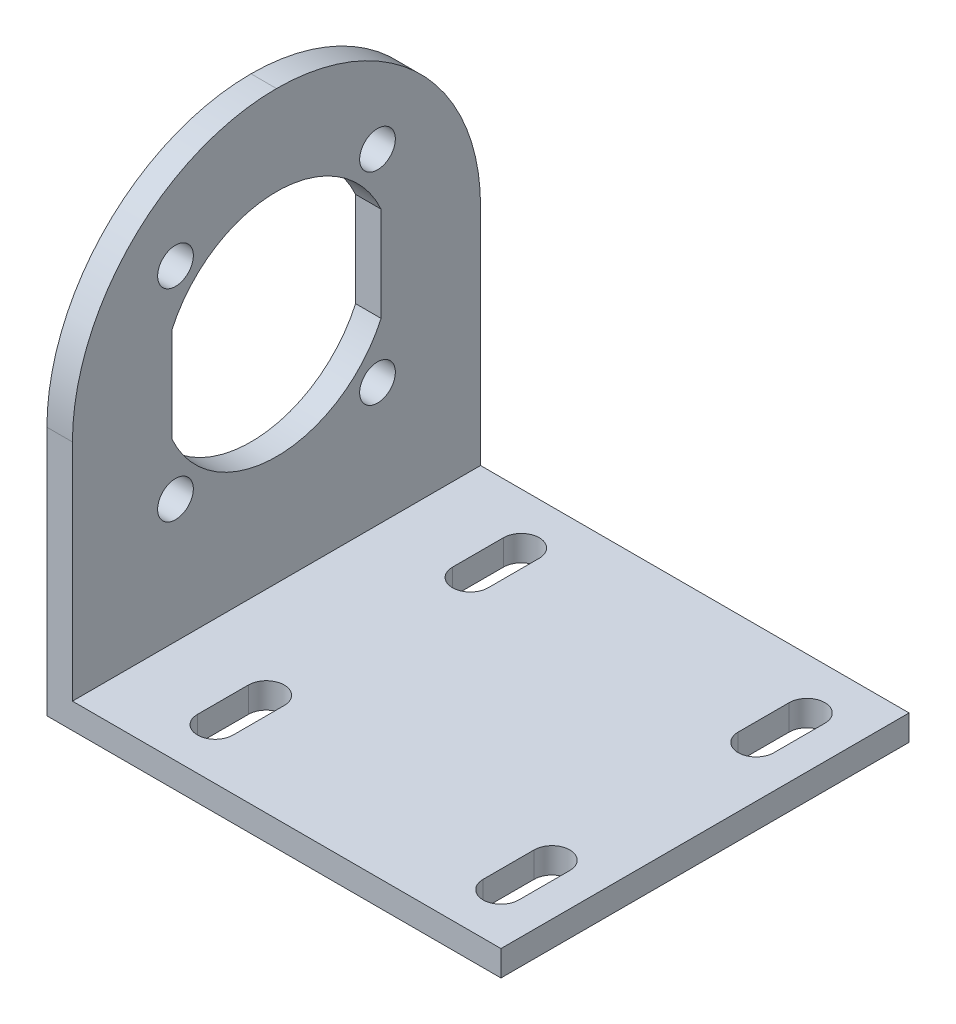
ISO-10303-21;
HEADER;
FILE_DESCRIPTION(('STEP AP214'),'2;1');
FILE_NAME('part.step','',(''),(''),'','','');
FILE_SCHEMA(('AUTOMOTIVE_DESIGN { 1 0 10303 214 1 1 1 1 }'));
ENDSEC;
DATA;
#1=APPLICATION_CONTEXT('core data for automotive mechanical design processes');
#2=APPLICATION_PROTOCOL_DEFINITION('international standard','automotive_design',2000,#1);
#3=PRODUCT_CONTEXT('',#1,'mechanical');
#4=PRODUCT('Part','Part','',(#3));
#5=PRODUCT_RELATED_PRODUCT_CATEGORY('part','',(#4));
#6=PRODUCT_DEFINITION_FORMATION('','',#4);
#7=PRODUCT_DEFINITION_CONTEXT('part definition',#1,'design');
#8=PRODUCT_DEFINITION('design','',#6,#7);
#9=PRODUCT_DEFINITION_SHAPE('','',#8);
#10=(LENGTH_UNIT() NAMED_UNIT(*) SI_UNIT(.MILLI.,.METRE.));
#11=(NAMED_UNIT(*) PLANE_ANGLE_UNIT() SI_UNIT($,.RADIAN.));
#12=(NAMED_UNIT(*) SI_UNIT($,.STERADIAN.) SOLID_ANGLE_UNIT());
#13=UNCERTAINTY_MEASURE_WITH_UNIT(LENGTH_MEASURE(1.E-05),#10,'distance_accuracy_value','');
#14=(GEOMETRIC_REPRESENTATION_CONTEXT(3) GLOBAL_UNCERTAINTY_ASSIGNED_CONTEXT((#13)) GLOBAL_UNIT_ASSIGNED_CONTEXT((#10,
#11,#12)) REPRESENTATION_CONTEXT('',''));
#15=CARTESIAN_POINT('',(0.,0.,0.));
#16=DIRECTION('',(0.,0.,1.));
#17=DIRECTION('',(1.,0.,0.));
#18=AXIS2_PLACEMENT_3D('',#15,#16,#17);
#19=CARTESIAN_POINT('',(0.,44.5,20.));
#20=DIRECTION('',(1.,0.,0.));
#21=DIRECTION('',(0.,1.,0.));
#22=AXIS2_PLACEMENT_3D('',#19,#20,#21);
#23=PLANE('',#22);
#24=CARTESIAN_POINT('',(0.,34.3994949366117,-9.89949493661168));
#25=DIRECTION('',(1.,0.,0.));
#26=DIRECTION('',(0.,1.,0.));
#27=AXIS2_PLACEMENT_3D('',#24,#25,#26);
#28=CIRCLE('',#27,1.75);
#29=CARTESIAN_POINT('',(0.,36.1494949366117,-9.89949493661168));
#30=VERTEX_POINT('',#29);
#31=EDGE_CURVE('E371',#30,#30,#28,.F.);
#32=ORIENTED_EDGE('',*,*,#31,.F.);
#33=EDGE_LOOP('',(#32));
#34=FACE_BOUND('',#33,.T.);
#35=CARTESIAN_POINT('',(0.,34.3994949366117,9.89949493661165));
#36=DIRECTION('',(1.,0.,0.));
#37=DIRECTION('',(0.,1.,0.));
#38=AXIS2_PLACEMENT_3D('',#35,#36,#37);
#39=CIRCLE('',#38,1.75);
#40=CARTESIAN_POINT('',(0.,36.1494949366117,9.89949493661165));
#41=VERTEX_POINT('',#40);
#42=EDGE_CURVE('E365',#41,#41,#39,.F.);
#43=ORIENTED_EDGE('',*,*,#42,.F.);
#44=EDGE_LOOP('',(#43));
#45=FACE_BOUND('',#44,.T.);
#46=CARTESIAN_POINT('',(0.,14.6005050633884,9.89949493661168));
#47=DIRECTION('',(1.,0.,0.));
#48=DIRECTION('',(0.,1.,0.));
#49=AXIS2_PLACEMENT_3D('',#46,#47,#48);
#50=CIRCLE('',#49,1.75);
#51=CARTESIAN_POINT('',(0.,16.3505050633884,9.89949493661168));
#52=VERTEX_POINT('',#51);
#53=EDGE_CURVE('E358',#52,#52,#50,.F.);
#54=ORIENTED_EDGE('',*,*,#53,.F.);
#55=EDGE_LOOP('',(#54));
#56=FACE_BOUND('',#55,.T.);
#57=CARTESIAN_POINT('',(0.,14.6005050633883,-9.89949493661165));
#58=DIRECTION('',(1.,0.,0.));
#59=DIRECTION('',(0.,1.,0.));
#60=AXIS2_PLACEMENT_3D('',#57,#58,#59);
#61=CIRCLE('',#60,1.74999999999999);
#62=CARTESIAN_POINT('',(0.,16.3505050633883,-9.89949493661165));
#63=VERTEX_POINT('',#62);
#64=EDGE_CURVE('E357',#63,#63,#61,.F.);
#65=ORIENTED_EDGE('',*,*,#64,.F.);
#66=EDGE_LOOP('',(#65));
#67=FACE_BOUND('',#66,.T.);
#68=DIRECTION('',(0.,-1.,0.));
#69=VECTOR('',#68,1.);
#70=CARTESIAN_POINT('',(0.,29.1368092477479,-10.25));
#71=LINE('',#70,#69);
#72=CARTESIAN_POINT('',(0.,29.1368092477479,-10.25));
#73=VERTEX_POINT('',#72);
#74=CARTESIAN_POINT('',(0.,19.8631907522521,-10.25));
#75=VERTEX_POINT('',#74);
#76=EDGE_CURVE('E379',#73,#75,#71,.T.);
#77=ORIENTED_EDGE('',*,*,#76,.F.);
#78=CARTESIAN_POINT('',(0.,24.5,0.));
#79=DIRECTION('',(1.,0.,0.));
#80=DIRECTION('',(0.,1.,0.));
#81=AXIS2_PLACEMENT_3D('',#78,#79,#80);
#82=CIRCLE('',#81,11.25);
#83=CARTESIAN_POINT('',(0.,29.1368092477478,10.25));
#84=VERTEX_POINT('',#83);
#85=EDGE_CURVE('E382',#84,#73,#82,.F.);
#86=ORIENTED_EDGE('',*,*,#85,.F.);
#87=DIRECTION('',(0.,1.,0.));
#88=VECTOR('',#87,1.);
#89=CARTESIAN_POINT('',(0.,29.1368092477478,10.25));
#90=LINE('',#89,#88);
#91=CARTESIAN_POINT('',(0.,19.8631907522522,10.25));
#92=VERTEX_POINT('',#91);
#93=EDGE_CURVE('E399',#92,#84,#90,.T.);
#94=ORIENTED_EDGE('',*,*,#93,.F.);
#95=CARTESIAN_POINT('',(0.,24.5,0.));
#96=DIRECTION('',(1.,0.,0.));
#97=DIRECTION('',(0.,1.,0.));
#98=AXIS2_PLACEMENT_3D('',#95,#96,#97);
#99=CIRCLE('',#98,11.25);
#100=EDGE_CURVE('E361',#75,#92,#99,.F.);
#101=ORIENTED_EDGE('',*,*,#100,.F.);
#102=EDGE_LOOP('',(#77,#86,#94,#101));
#103=FACE_BOUND('',#102,.T.);
#104=CARTESIAN_POINT('',(0.,24.5,0.));
#105=DIRECTION('',(1.,0.,0.));
#106=DIRECTION('',(0.,1.,0.));
#107=AXIS2_PLACEMENT_3D('',#104,#105,#106);
#108=CIRCLE('',#107,20.);
#109=CARTESIAN_POINT('',(0.,24.5,20.));
#110=VERTEX_POINT('',#109);
#111=CARTESIAN_POINT('',(0.,44.5,0.));
#112=VERTEX_POINT('',#111);
#113=EDGE_CURVE('E442',#110,#112,#108,.F.);
#114=ORIENTED_EDGE('',*,*,#113,.T.);
#115=CARTESIAN_POINT('',(0.,24.5,0.));
#116=DIRECTION('',(1.,0.,0.));
#117=DIRECTION('',(0.,1.,0.));
#118=AXIS2_PLACEMENT_3D('',#115,#116,#117);
#119=CIRCLE('',#118,20.);
#120=CARTESIAN_POINT('',(0.,24.5,-20.));
#121=VERTEX_POINT('',#120);
#122=EDGE_CURVE('E444',#112,#121,#119,.F.);
#123=ORIENTED_EDGE('',*,*,#122,.T.);
#124=DIRECTION('',(0.,-1.,0.));
#125=VECTOR('',#124,1.);
#126=CARTESIAN_POINT('',(0.,44.5,-20.));
#127=LINE('',#126,#125);
#128=CARTESIAN_POINT('',(0.,0.,-20.));
#129=VERTEX_POINT('',#128);
#130=EDGE_CURVE('E421',#121,#129,#127,.T.);
#131=ORIENTED_EDGE('',*,*,#130,.T.);
#132=DIRECTION('',(0.,0.,-1.));
#133=VECTOR('',#132,1.);
#134=CARTESIAN_POINT('',(0.,0.,20.));
#135=LINE('',#134,#133);
#136=CARTESIAN_POINT('',(0.,0.,20.));
#137=VERTEX_POINT('',#136);
#138=EDGE_CURVE('E439',#137,#129,#135,.T.);
#139=ORIENTED_EDGE('',*,*,#138,.F.);
#140=DIRECTION('',(0.,-1.,0.));
#141=VECTOR('',#140,1.);
#142=CARTESIAN_POINT('',(0.,44.5,20.));
#143=LINE('',#142,#141);
#144=EDGE_CURVE('E408',#110,#137,#143,.T.);
#145=ORIENTED_EDGE('',*,*,#144,.F.);
#146=EDGE_LOOP('',(#114,#123,#131,#139,#145));
#147=FACE_BOUND('',#146,.T.);
#148=ADVANCED_FACE('F40',(#34,#45,#56,#67,#103,#147),#23,.F.);
#149=CARTESIAN_POINT('',(0.,0.,20.));
#150=DIRECTION('',(0.,1.,0.));
#151=DIRECTION('',(0.,0.,1.));
#152=AXIS2_PLACEMENT_3D('',#149,#150,#151);
#153=PLANE('',#152);
#154=DIRECTION('',(0.,0.,1.));
#155=VECTOR('',#154,1.);
#156=CARTESIAN_POINT('',(41.25,0.,10.));
#157=LINE('',#156,#155);
#158=CARTESIAN_POINT('',(41.25,0.,10.));
#159=VERTEX_POINT('',#158);
#160=CARTESIAN_POINT('',(41.25,0.,15.));
#161=VERTEX_POINT('',#160);
#162=EDGE_CURVE('E263',#159,#161,#157,.T.);
#163=ORIENTED_EDGE('',*,*,#162,.F.);
#164=CARTESIAN_POINT('',(39.5,0.,10.));
#165=DIRECTION('',(0.,1.,0.));
#166=DIRECTION('',(0.,0.,1.));
#167=AXIS2_PLACEMENT_3D('',#164,#165,#166);
#168=CIRCLE('',#167,1.75000000000001);
#169=CARTESIAN_POINT('',(37.75,0.,10.));
#170=VERTEX_POINT('',#169);
#171=EDGE_CURVE('E267',#170,#159,#168,.F.);
#172=ORIENTED_EDGE('',*,*,#171,.F.);
#173=DIRECTION('',(0.,0.,-1.));
#174=VECTOR('',#173,1.);
#175=CARTESIAN_POINT('',(37.75,0.,10.));
#176=LINE('',#175,#174);
#177=CARTESIAN_POINT('',(37.75,0.,15.));
#178=VERTEX_POINT('',#177);
#179=EDGE_CURVE('E284',#178,#170,#176,.T.);
#180=ORIENTED_EDGE('',*,*,#179,.F.);
#181=CARTESIAN_POINT('',(39.5,0.,15.));
#182=DIRECTION('',(0.,1.,0.));
#183=DIRECTION('',(0.,0.,1.));
#184=AXIS2_PLACEMENT_3D('',#181,#182,#183);
#185=CIRCLE('',#184,1.75000000000001);
#186=EDGE_CURVE('E56',#161,#178,#185,.F.);
#187=ORIENTED_EDGE('',*,*,#186,.F.);
#188=EDGE_LOOP('',(#163,#172,#180,#187));
#189=FACE_BOUND('',#188,.T.);
#190=DIRECTION('',(0.,0.,1.));
#191=VECTOR('',#190,1.);
#192=CARTESIAN_POINT('',(13.25,0.,-15.));
#193=LINE('',#192,#191);
#194=CARTESIAN_POINT('',(13.25,0.,-15.));
#195=VERTEX_POINT('',#194);
#196=CARTESIAN_POINT('',(13.25,0.,-10.));
#197=VERTEX_POINT('',#196);
#198=EDGE_CURVE('E295',#195,#197,#193,.T.);
#199=ORIENTED_EDGE('',*,*,#198,.F.);
#200=CARTESIAN_POINT('',(11.5,0.,-15.));
#201=DIRECTION('',(0.,1.,0.));
#202=DIRECTION('',(0.,0.,1.));
#203=AXIS2_PLACEMENT_3D('',#200,#201,#202);
#204=CIRCLE('',#203,1.75);
#205=CARTESIAN_POINT('',(9.75000000000002,0.,-15.));
#206=VERTEX_POINT('',#205);
#207=EDGE_CURVE('E298',#206,#195,#204,.F.);
#208=ORIENTED_EDGE('',*,*,#207,.F.);
#209=DIRECTION('',(0.,0.,-1.));
#210=VECTOR('',#209,1.);
#211=CARTESIAN_POINT('',(9.75000000000002,0.,-15.));
#212=LINE('',#211,#210);
#213=CARTESIAN_POINT('',(9.75000000000002,0.,-10.));
#214=VERTEX_POINT('',#213);
#215=EDGE_CURVE('E264',#214,#206,#212,.T.);
#216=ORIENTED_EDGE('',*,*,#215,.F.);
#217=CARTESIAN_POINT('',(11.5,0.,-10.));
#218=DIRECTION('',(0.,1.,0.));
#219=DIRECTION('',(0.,0.,1.));
#220=AXIS2_PLACEMENT_3D('',#217,#218,#219);
#221=CIRCLE('',#220,1.75);
#222=EDGE_CURVE('E64',#197,#214,#221,.F.);
#223=ORIENTED_EDGE('',*,*,#222,.F.);
#224=EDGE_LOOP('',(#199,#208,#216,#223));
#225=FACE_BOUND('',#224,.T.);
#226=DIRECTION('',(0.,0.,1.));
#227=VECTOR('',#226,1.);
#228=CARTESIAN_POINT('',(41.25,0.,-15.));
#229=LINE('',#228,#227);
#230=CARTESIAN_POINT('',(41.25,0.,-15.));
#231=VERTEX_POINT('',#230);
#232=CARTESIAN_POINT('',(41.25,0.,-10.));
#233=VERTEX_POINT('',#232);
#234=EDGE_CURVE('E244',#231,#233,#229,.T.);
#235=ORIENTED_EDGE('',*,*,#234,.F.);
#236=CARTESIAN_POINT('',(39.5,0.,-15.));
#237=DIRECTION('',(0.,1.,0.));
#238=DIRECTION('',(0.,0.,1.));
#239=AXIS2_PLACEMENT_3D('',#236,#237,#238);
#240=CIRCLE('',#239,1.75);
#241=CARTESIAN_POINT('',(37.75,0.,-15.));
#242=VERTEX_POINT('',#241);
#243=EDGE_CURVE('E223',#242,#231,#240,.F.);
#244=ORIENTED_EDGE('',*,*,#243,.F.);
#245=DIRECTION('',(0.,0.,-1.));
#246=VECTOR('',#245,1.);
#247=CARTESIAN_POINT('',(37.75,0.,-15.));
#248=LINE('',#247,#246);
#249=CARTESIAN_POINT('',(37.75,0.,-10.));
#250=VERTEX_POINT('',#249);
#251=EDGE_CURVE('E235',#250,#242,#248,.T.);
#252=ORIENTED_EDGE('',*,*,#251,.F.);
#253=CARTESIAN_POINT('',(39.5,0.,-10.));
#254=DIRECTION('',(0.,1.,0.));
#255=DIRECTION('',(0.,0.,1.));
#256=AXIS2_PLACEMENT_3D('',#253,#254,#255);
#257=CIRCLE('',#256,1.75);
#258=EDGE_CURVE('E248',#233,#250,#257,.F.);
#259=ORIENTED_EDGE('',*,*,#258,.F.);
#260=EDGE_LOOP('',(#235,#244,#252,#259));
#261=FACE_BOUND('',#260,.T.);
#262=DIRECTION('',(0.,0.,1.));
#263=VECTOR('',#262,1.);
#264=CARTESIAN_POINT('',(13.25,0.,10.));
#265=LINE('',#264,#263);
#266=CARTESIAN_POINT('',(13.25,0.,10.));
#267=VERTEX_POINT('',#266);
#268=CARTESIAN_POINT('',(13.25,0.,15.));
#269=VERTEX_POINT('',#268);
#270=EDGE_CURVE('E324',#267,#269,#265,.T.);
#271=ORIENTED_EDGE('',*,*,#270,.F.);
#272=CARTESIAN_POINT('',(11.5,0.,10.));
#273=DIRECTION('',(0.,1.,0.));
#274=DIRECTION('',(0.,0.,1.));
#275=AXIS2_PLACEMENT_3D('',#272,#273,#274);
#276=CIRCLE('',#275,1.75);
#277=CARTESIAN_POINT('',(9.75000000000002,0.,10.));
#278=VERTEX_POINT('',#277);
#279=EDGE_CURVE('E327',#278,#267,#276,.F.);
#280=ORIENTED_EDGE('',*,*,#279,.F.);
#281=DIRECTION('',(0.,0.,-1.));
#282=VECTOR('',#281,1.);
#283=CARTESIAN_POINT('',(9.75000000000002,0.,10.));
#284=LINE('',#283,#282);
#285=CARTESIAN_POINT('',(9.75000000000002,0.,15.));
#286=VERTEX_POINT('',#285);
#287=EDGE_CURVE('E344',#286,#278,#284,.T.);
#288=ORIENTED_EDGE('',*,*,#287,.F.);
#289=CARTESIAN_POINT('',(11.5,0.,15.));
#290=DIRECTION('',(0.,1.,0.));
#291=DIRECTION('',(0.,0.,1.));
#292=AXIS2_PLACEMENT_3D('',#289,#290,#291);
#293=CIRCLE('',#292,1.75);
#294=EDGE_CURVE('E293',#269,#286,#293,.F.);
#295=ORIENTED_EDGE('',*,*,#294,.F.);
#296=EDGE_LOOP('',(#271,#280,#288,#295));
#297=FACE_BOUND('',#296,.T.);
#298=DIRECTION('',(1.,0.,0.));
#299=VECTOR('',#298,1.);
#300=CARTESIAN_POINT('',(0.,0.,-20.));
#301=LINE('',#300,#299);
#302=CARTESIAN_POINT('',(44.5,0.,-20.));
#303=VERTEX_POINT('',#302);
#304=EDGE_CURVE('E423',#129,#303,#301,.T.);
#305=ORIENTED_EDGE('',*,*,#304,.T.);
#306=DIRECTION('',(0.,0.,-1.));
#307=VECTOR('',#306,1.);
#308=CARTESIAN_POINT('',(44.5,0.,20.));
#309=LINE('',#308,#307);
#310=CARTESIAN_POINT('',(44.5,0.,20.));
#311=VERTEX_POINT('',#310);
#312=EDGE_CURVE('E436',#311,#303,#309,.T.);
#313=ORIENTED_EDGE('',*,*,#312,.F.);
#314=DIRECTION('',(1.,0.,0.));
#315=VECTOR('',#314,1.);
#316=CARTESIAN_POINT('',(0.,0.,20.));
#317=LINE('',#316,#315);
#318=EDGE_CURVE('E410',#137,#311,#317,.T.);
#319=ORIENTED_EDGE('',*,*,#318,.F.);
#320=ORIENTED_EDGE('',*,*,#138,.T.);
#321=EDGE_LOOP('',(#305,#313,#319,#320));
#322=FACE_BOUND('',#321,.T.);
#323=ADVANCED_FACE('F241',(#189,#225,#261,#297,#322),#153,.F.);
#324=CARTESIAN_POINT('',(44.5,0.,20.));
#325=DIRECTION('',(-1.,0.,0.));
#326=DIRECTION('',(0.,-1.,0.));
#327=AXIS2_PLACEMENT_3D('',#324,#325,#326);
#328=PLANE('',#327);
#329=DIRECTION('',(0.,1.,0.));
#330=VECTOR('',#329,1.);
#331=CARTESIAN_POINT('',(44.5,0.,-20.));
#332=LINE('',#331,#330);
#333=CARTESIAN_POINT('',(44.5,2.5,-20.));
#334=VERTEX_POINT('',#333);
#335=EDGE_CURVE('E425',#303,#334,#332,.T.);
#336=ORIENTED_EDGE('',*,*,#335,.T.);
#337=DIRECTION('',(0.,0.,-1.));
#338=VECTOR('',#337,1.);
#339=CARTESIAN_POINT('',(44.5,2.5,20.));
#340=LINE('',#339,#338);
#341=CARTESIAN_POINT('',(44.5,2.5,20.));
#342=VERTEX_POINT('',#341);
#343=EDGE_CURVE('E433',#342,#334,#340,.T.);
#344=ORIENTED_EDGE('',*,*,#343,.F.);
#345=DIRECTION('',(0.,1.,0.));
#346=VECTOR('',#345,1.);
#347=CARTESIAN_POINT('',(44.5,0.,20.));
#348=LINE('',#347,#346);
#349=EDGE_CURVE('E413',#311,#342,#348,.T.);
#350=ORIENTED_EDGE('',*,*,#349,.F.);
#351=ORIENTED_EDGE('',*,*,#312,.T.);
#352=EDGE_LOOP('',(#336,#344,#350,#351));
#353=FACE_BOUND('',#352,.T.);
#354=ADVANCED_FACE('F479',(#353),#328,.F.);
#355=CARTESIAN_POINT('',(44.5,2.5,20.));
#356=DIRECTION('',(0.,-1.,0.));
#357=DIRECTION('',(1.,0.,0.));
#358=AXIS2_PLACEMENT_3D('',#355,#356,#357);
#359=PLANE('',#358);
#360=DIRECTION('',(0.,0.,1.));
#361=VECTOR('',#360,1.);
#362=CARTESIAN_POINT('',(37.75,2.5,10.));
#363=LINE('',#362,#361);
#364=CARTESIAN_POINT('',(37.75,2.5,10.));
#365=VERTEX_POINT('',#364);
#366=CARTESIAN_POINT('',(37.75,2.5,15.));
#367=VERTEX_POINT('',#366);
#368=EDGE_CURVE('E272',#365,#367,#363,.T.);
#369=ORIENTED_EDGE('',*,*,#368,.F.);
#370=CARTESIAN_POINT('',(39.5,2.5,10.));
#371=DIRECTION('',(0.,1.,0.));
#372=DIRECTION('',(-1.,0.,0.));
#373=AXIS2_PLACEMENT_3D('',#370,#371,#372);
#374=CIRCLE('',#373,1.75000000000001);
#375=CARTESIAN_POINT('',(41.25,2.5,10.));
#376=VERTEX_POINT('',#375);
#377=EDGE_CURVE('E270',#376,#365,#374,.T.);
#378=ORIENTED_EDGE('',*,*,#377,.F.);
#379=DIRECTION('',(0.,0.,-1.));
#380=VECTOR('',#379,1.);
#381=CARTESIAN_POINT('',(41.25,2.5,10.));
#382=LINE('',#381,#380);
#383=CARTESIAN_POINT('',(41.25,2.5,15.));
#384=VERTEX_POINT('',#383);
#385=EDGE_CURVE('E278',#384,#376,#382,.T.);
#386=ORIENTED_EDGE('',*,*,#385,.F.);
#387=CARTESIAN_POINT('',(39.5,2.5,15.));
#388=DIRECTION('',(0.,1.,0.));
#389=DIRECTION('',(-1.,0.,0.));
#390=AXIS2_PLACEMENT_3D('',#387,#388,#389);
#391=CIRCLE('',#390,1.75000000000001);
#392=EDGE_CURVE('E275',#367,#384,#391,.T.);
#393=ORIENTED_EDGE('',*,*,#392,.F.);
#394=EDGE_LOOP('',(#369,#378,#386,#393));
#395=FACE_BOUND('',#394,.T.);
#396=DIRECTION('',(0.,0.,1.));
#397=VECTOR('',#396,1.);
#398=CARTESIAN_POINT('',(9.75000000000002,2.5,-15.));
#399=LINE('',#398,#397);
#400=CARTESIAN_POINT('',(9.75000000000002,2.5,-15.));
#401=VERTEX_POINT('',#400);
#402=CARTESIAN_POINT('',(9.75000000000002,2.5,-10.));
#403=VERTEX_POINT('',#402);
#404=EDGE_CURVE('E303',#401,#403,#399,.T.);
#405=ORIENTED_EDGE('',*,*,#404,.F.);
#406=CARTESIAN_POINT('',(11.5,2.5,-15.));
#407=DIRECTION('',(0.,1.,0.));
#408=DIRECTION('',(-1.,0.,0.));
#409=AXIS2_PLACEMENT_3D('',#406,#407,#408);
#410=CIRCLE('',#409,1.75);
#411=CARTESIAN_POINT('',(13.25,2.5,-15.));
#412=VERTEX_POINT('',#411);
#413=EDGE_CURVE('E301',#412,#401,#410,.T.);
#414=ORIENTED_EDGE('',*,*,#413,.F.);
#415=DIRECTION('',(0.,0.,-1.));
#416=VECTOR('',#415,1.);
#417=CARTESIAN_POINT('',(13.25,2.5,-15.));
#418=LINE('',#417,#416);
#419=CARTESIAN_POINT('',(13.25,2.5,-10.));
#420=VERTEX_POINT('',#419);
#421=EDGE_CURVE('E309',#420,#412,#418,.T.);
#422=ORIENTED_EDGE('',*,*,#421,.F.);
#423=CARTESIAN_POINT('',(11.5,2.5,-10.));
#424=DIRECTION('',(0.,1.,0.));
#425=DIRECTION('',(-1.,0.,0.));
#426=AXIS2_PLACEMENT_3D('',#423,#424,#425);
#427=CIRCLE('',#426,1.75);
#428=EDGE_CURVE('E306',#403,#420,#427,.T.);
#429=ORIENTED_EDGE('',*,*,#428,.F.);
#430=EDGE_LOOP('',(#405,#414,#422,#429));
#431=FACE_BOUND('',#430,.T.);
#432=DIRECTION('',(0.,0.,1.));
#433=VECTOR('',#432,1.);
#434=CARTESIAN_POINT('',(37.75,2.5,-15.));
#435=LINE('',#434,#433);
#436=CARTESIAN_POINT('',(37.75,2.5,-15.));
#437=VERTEX_POINT('',#436);
#438=CARTESIAN_POINT('',(37.75,2.5,-10.));
#439=VERTEX_POINT('',#438);
#440=EDGE_CURVE('E246',#437,#439,#435,.T.);
#441=ORIENTED_EDGE('',*,*,#440,.F.);
#442=CARTESIAN_POINT('',(39.5,2.5,-15.));
#443=DIRECTION('',(0.,1.,0.));
#444=DIRECTION('',(-1.,0.,0.));
#445=AXIS2_PLACEMENT_3D('',#442,#443,#444);
#446=CIRCLE('',#445,1.75);
#447=CARTESIAN_POINT('',(41.25,2.5,-15.));
#448=VERTEX_POINT('',#447);
#449=EDGE_CURVE('E226',#448,#437,#446,.T.);
#450=ORIENTED_EDGE('',*,*,#449,.F.);
#451=DIRECTION('',(0.,0.,-1.));
#452=VECTOR('',#451,1.);
#453=CARTESIAN_POINT('',(41.25,2.5,-15.));
#454=LINE('',#453,#452);
#455=CARTESIAN_POINT('',(41.25,2.5,-10.));
#456=VERTEX_POINT('',#455);
#457=EDGE_CURVE('E231',#456,#448,#454,.T.);
#458=ORIENTED_EDGE('',*,*,#457,.F.);
#459=CARTESIAN_POINT('',(39.5,2.5,-10.));
#460=DIRECTION('',(0.,1.,0.));
#461=DIRECTION('',(-1.,0.,0.));
#462=AXIS2_PLACEMENT_3D('',#459,#460,#461);
#463=CIRCLE('',#462,1.75);
#464=EDGE_CURVE('E253',#439,#456,#463,.T.);
#465=ORIENTED_EDGE('',*,*,#464,.F.);
#466=EDGE_LOOP('',(#441,#450,#458,#465));
#467=FACE_BOUND('',#466,.T.);
#468=DIRECTION('',(0.,0.,1.));
#469=VECTOR('',#468,1.);
#470=CARTESIAN_POINT('',(9.75000000000002,2.5,10.));
#471=LINE('',#470,#469);
#472=CARTESIAN_POINT('',(9.75000000000002,2.5,10.));
#473=VERTEX_POINT('',#472);
#474=CARTESIAN_POINT('',(9.75000000000002,2.5,15.));
#475=VERTEX_POINT('',#474);
#476=EDGE_CURVE('E332',#473,#475,#471,.T.);
#477=ORIENTED_EDGE('',*,*,#476,.F.);
#478=CARTESIAN_POINT('',(11.5,2.5,10.));
#479=DIRECTION('',(0.,1.,0.));
#480=DIRECTION('',(-1.,0.,0.));
#481=AXIS2_PLACEMENT_3D('',#478,#479,#480);
#482=CIRCLE('',#481,1.75);
#483=CARTESIAN_POINT('',(13.25,2.5,10.));
#484=VERTEX_POINT('',#483);
#485=EDGE_CURVE('E330',#484,#473,#482,.T.);
#486=ORIENTED_EDGE('',*,*,#485,.F.);
#487=DIRECTION('',(0.,0.,-1.));
#488=VECTOR('',#487,1.);
#489=CARTESIAN_POINT('',(13.25,2.5,10.));
#490=LINE('',#489,#488);
#491=CARTESIAN_POINT('',(13.25,2.5,15.));
#492=VERTEX_POINT('',#491);
#493=EDGE_CURVE('E338',#492,#484,#490,.T.);
#494=ORIENTED_EDGE('',*,*,#493,.F.);
#495=CARTESIAN_POINT('',(11.5,2.5,15.));
#496=DIRECTION('',(0.,1.,0.));
#497=DIRECTION('',(-1.,0.,0.));
#498=AXIS2_PLACEMENT_3D('',#495,#496,#497);
#499=CIRCLE('',#498,1.75);
#500=EDGE_CURVE('E335',#475,#492,#499,.T.);
#501=ORIENTED_EDGE('',*,*,#500,.F.);
#502=EDGE_LOOP('',(#477,#486,#494,#501));
#503=FACE_BOUND('',#502,.T.);
#504=DIRECTION('',(-1.,0.,0.));
#505=VECTOR('',#504,1.);
#506=CARTESIAN_POINT('',(44.5,2.5,-20.));
#507=LINE('',#506,#505);
#508=CARTESIAN_POINT('',(2.5,2.5,-20.));
#509=VERTEX_POINT('',#508);
#510=EDGE_CURVE('E427',#334,#509,#507,.T.);
#511=ORIENTED_EDGE('',*,*,#510,.T.);
#512=DIRECTION('',(0.,0.,-1.));
#513=VECTOR('',#512,1.);
#514=CARTESIAN_POINT('',(2.5,2.5,20.));
#515=LINE('',#514,#513);
#516=CARTESIAN_POINT('',(2.5,2.5,20.));
#517=VERTEX_POINT('',#516);
#518=EDGE_CURVE('E420',#517,#509,#515,.T.);
#519=ORIENTED_EDGE('',*,*,#518,.F.);
#520=DIRECTION('',(-1.,0.,0.));
#521=VECTOR('',#520,1.);
#522=CARTESIAN_POINT('',(44.5,2.5,20.));
#523=LINE('',#522,#521);
#524=EDGE_CURVE('E415',#342,#517,#523,.T.);
#525=ORIENTED_EDGE('',*,*,#524,.F.);
#526=ORIENTED_EDGE('',*,*,#343,.T.);
#527=EDGE_LOOP('',(#511,#519,#525,#526));
#528=FACE_BOUND('',#527,.T.);
#529=ADVANCED_FACE('F486',(#395,#431,#467,#503,#528),#359,.F.);
#530=CARTESIAN_POINT('',(2.5,2.5,20.));
#531=DIRECTION('',(-1.,0.,0.));
#532=DIRECTION('',(0.,-1.,0.));
#533=AXIS2_PLACEMENT_3D('',#530,#531,#532);
#534=PLANE('',#533);
#535=CARTESIAN_POINT('',(2.5,34.3994949366117,-9.89949493661168));
#536=DIRECTION('',(1.,0.,0.));
#537=DIRECTION('',(0.,1.,0.));
#538=AXIS2_PLACEMENT_3D('',#535,#536,#537);
#539=CIRCLE('',#538,1.75);
#540=CARTESIAN_POINT('',(2.5,36.1494949366117,-9.89949493661168));
#541=VERTEX_POINT('',#540);
#542=EDGE_CURVE('E353',#541,#541,#539,.T.);
#543=ORIENTED_EDGE('',*,*,#542,.F.);
#544=EDGE_LOOP('',(#543));
#545=FACE_BOUND('',#544,.T.);
#546=CARTESIAN_POINT('',(2.5,34.3994949366117,9.89949493661165));
#547=DIRECTION('',(1.,0.,0.));
#548=DIRECTION('',(0.,1.,0.));
#549=AXIS2_PLACEMENT_3D('',#546,#547,#548);
#550=CIRCLE('',#549,1.75);
#551=CARTESIAN_POINT('',(2.5,36.1494949366117,9.89949493661165));
#552=VERTEX_POINT('',#551);
#553=EDGE_CURVE('E368',#552,#552,#550,.T.);
#554=ORIENTED_EDGE('',*,*,#553,.F.);
#555=EDGE_LOOP('',(#554));
#556=FACE_BOUND('',#555,.T.);
#557=CARTESIAN_POINT('',(2.5,14.6005050633884,9.89949493661168));
#558=DIRECTION('',(1.,0.,0.));
#559=DIRECTION('',(0.,1.,0.));
#560=AXIS2_PLACEMENT_3D('',#557,#558,#559);
#561=CIRCLE('',#560,1.75);
#562=CARTESIAN_POINT('',(2.5,16.3505050633884,9.89949493661168));
#563=VERTEX_POINT('',#562);
#564=EDGE_CURVE('E362',#563,#563,#561,.T.);
#565=ORIENTED_EDGE('',*,*,#564,.F.);
#566=EDGE_LOOP('',(#565));
#567=FACE_BOUND('',#566,.T.);
#568=CARTESIAN_POINT('',(2.5,14.6005050633883,-9.89949493661165));
#569=DIRECTION('',(1.,0.,0.));
#570=DIRECTION('',(0.,1.,0.));
#571=AXIS2_PLACEMENT_3D('',#568,#569,#570);
#572=CIRCLE('',#571,1.74999999999999);
#573=CARTESIAN_POINT('',(2.5,16.3505050633883,-9.89949493661165));
#574=VERTEX_POINT('',#573);
#575=EDGE_CURVE('E354',#574,#574,#572,.T.);
#576=ORIENTED_EDGE('',*,*,#575,.F.);
#577=EDGE_LOOP('',(#576));
#578=FACE_BOUND('',#577,.T.);
#579=DIRECTION('',(0.,-1.,0.));
#580=VECTOR('',#579,1.);
#581=CARTESIAN_POINT('',(2.5,29.1368092477478,10.25));
#582=LINE('',#581,#580);
#583=CARTESIAN_POINT('',(2.5,29.1368092477478,10.25));
#584=VERTEX_POINT('',#583);
#585=CARTESIAN_POINT('',(2.5,19.8631907522522,10.25));
#586=VERTEX_POINT('',#585);
#587=EDGE_CURVE('E387',#584,#586,#582,.T.);
#588=ORIENTED_EDGE('',*,*,#587,.F.);
#589=CARTESIAN_POINT('',(2.5,24.5,0.));
#590=DIRECTION('',(1.,0.,0.));
#591=DIRECTION('',(0.,1.,0.));
#592=AXIS2_PLACEMENT_3D('',#589,#590,#591);
#593=CIRCLE('',#592,11.25);
#594=CARTESIAN_POINT('',(2.5,29.1368092477479,-10.25));
#595=VERTEX_POINT('',#594);
#596=EDGE_CURVE('E385',#595,#584,#593,.T.);
#597=ORIENTED_EDGE('',*,*,#596,.F.);
#598=DIRECTION('',(0.,1.,0.));
#599=VECTOR('',#598,1.);
#600=CARTESIAN_POINT('',(2.5,29.1368092477479,-10.25));
#601=LINE('',#600,#599);
#602=CARTESIAN_POINT('',(2.5,19.8631907522521,-10.25));
#603=VERTEX_POINT('',#602);
#604=EDGE_CURVE('E393',#603,#595,#601,.T.);
#605=ORIENTED_EDGE('',*,*,#604,.F.);
#606=CARTESIAN_POINT('',(2.5,24.5,0.));
#607=DIRECTION('',(1.,0.,0.));
#608=DIRECTION('',(0.,1.,0.));
#609=AXIS2_PLACEMENT_3D('',#606,#607,#608);
#610=CIRCLE('',#609,11.25);
#611=EDGE_CURVE('E390',#586,#603,#610,.T.);
#612=ORIENTED_EDGE('',*,*,#611,.F.);
#613=EDGE_LOOP('',(#588,#597,#605,#612));
#614=FACE_BOUND('',#613,.T.);
#615=DIRECTION('',(0.,1.,0.));
#616=VECTOR('',#615,1.);
#617=CARTESIAN_POINT('',(2.5,2.5,-20.));
#618=LINE('',#617,#616);
#619=CARTESIAN_POINT('',(2.5,24.5,-20.));
#620=VERTEX_POINT('',#619);
#621=EDGE_CURVE('E411',#509,#620,#618,.T.);
#622=ORIENTED_EDGE('',*,*,#621,.T.);
#623=CARTESIAN_POINT('',(2.5,24.5,0.));
#624=DIRECTION('',(-1.,0.,0.));
#625=DIRECTION('',(0.,-1.,0.));
#626=AXIS2_PLACEMENT_3D('',#623,#624,#625);
#627=CIRCLE('',#626,20.);
#628=CARTESIAN_POINT('',(2.5,44.5,0.));
#629=VERTEX_POINT('',#628);
#630=EDGE_CURVE('E49',#620,#629,#627,.F.);
#631=ORIENTED_EDGE('',*,*,#630,.T.);
#632=CARTESIAN_POINT('',(2.5,24.5,0.));
#633=DIRECTION('',(-1.,0.,0.));
#634=DIRECTION('',(0.,-1.,0.));
#635=AXIS2_PLACEMENT_3D('',#632,#633,#634);
#636=CIRCLE('',#635,20.);
#637=CARTESIAN_POINT('',(2.5,24.5,20.));
#638=VERTEX_POINT('',#637);
#639=EDGE_CURVE('E449',#629,#638,#636,.F.);
#640=ORIENTED_EDGE('',*,*,#639,.T.);
#641=DIRECTION('',(0.,1.,0.));
#642=VECTOR('',#641,1.);
#643=CARTESIAN_POINT('',(2.5,2.5,20.));
#644=LINE('',#643,#642);
#645=EDGE_CURVE('E417',#517,#638,#644,.T.);
#646=ORIENTED_EDGE('',*,*,#645,.F.);
#647=ORIENTED_EDGE('',*,*,#518,.T.);
#648=EDGE_LOOP('',(#622,#631,#640,#646,#647));
#649=FACE_BOUND('',#648,.T.);
#650=ADVANCED_FACE('F453',(#545,#556,#567,#578,#614,#649),#534,.F.);
#651=CARTESIAN_POINT('',(0.,0.,20.));
#652=DIRECTION('',(0.,0.,1.));
#653=DIRECTION('',(1.,0.,0.));
#654=AXIS2_PLACEMENT_3D('',#651,#652,#653);
#655=PLANE('',#654);
#656=ORIENTED_EDGE('',*,*,#645,.T.);
#657=DIRECTION('',(-1.,0.,0.));
#658=VECTOR('',#657,1.);
#659=CARTESIAN_POINT('',(0.,24.5,20.));
#660=LINE('',#659,#658);
#661=EDGE_CURVE('E11',#638,#110,#660,.T.);
#662=ORIENTED_EDGE('',*,*,#661,.T.);
#663=ORIENTED_EDGE('',*,*,#144,.T.);
#664=ORIENTED_EDGE('',*,*,#318,.T.);
#665=ORIENTED_EDGE('',*,*,#349,.T.);
#666=ORIENTED_EDGE('',*,*,#524,.T.);
#667=EDGE_LOOP('',(#656,#662,#663,#664,#665,#666));
#668=FACE_BOUND('',#667,.T.);
#669=ADVANCED_FACE('F483',(#668),#655,.T.);
#670=CARTESIAN_POINT('',(0.,0.,-20.));
#671=DIRECTION('',(0.,0.,1.));
#672=DIRECTION('',(1.,0.,0.));
#673=AXIS2_PLACEMENT_3D('',#670,#671,#672);
#674=PLANE('',#673);
#675=ORIENTED_EDGE('',*,*,#130,.F.);
#676=DIRECTION('',(-1.,0.,0.));
#677=VECTOR('',#676,1.);
#678=CARTESIAN_POINT('',(0.,24.5,-20.));
#679=LINE('',#678,#677);
#680=EDGE_CURVE('E446',#121,#620,#679,.F.);
#681=ORIENTED_EDGE('',*,*,#680,.T.);
#682=ORIENTED_EDGE('',*,*,#621,.F.);
#683=ORIENTED_EDGE('',*,*,#510,.F.);
#684=ORIENTED_EDGE('',*,*,#335,.F.);
#685=ORIENTED_EDGE('',*,*,#304,.F.);
#686=EDGE_LOOP('',(#675,#681,#682,#683,#684,#685));
#687=FACE_BOUND('',#686,.T.);
#688=ADVANCED_FACE('F471',(#687),#674,.F.);
#689=CARTESIAN_POINT('',(0.,24.5,0.));
#690=DIRECTION('',(1.,0.,0.));
#691=DIRECTION('',(0.,0.,-1.));
#692=AXIS2_PLACEMENT_3D('',#689,#690,#691);
#693=CYLINDRICAL_SURFACE('',#692,20.);
#694=ORIENTED_EDGE('',*,*,#661,.F.);
#695=ORIENTED_EDGE('',*,*,#639,.F.);
#696=DIRECTION('',(-1.,0.,0.));
#697=VECTOR('',#696,1.);
#698=CARTESIAN_POINT('',(2.5,44.5,0.));
#699=LINE('',#698,#697);
#700=EDGE_CURVE('E44',#112,#629,#699,.F.);
#701=ORIENTED_EDGE('',*,*,#700,.F.);
#702=ORIENTED_EDGE('',*,*,#113,.F.);
#703=EDGE_LOOP('',(#694,#695,#701,#702));
#704=FACE_BOUND('',#703,.T.);
#705=ADVANCED_FACE('F42',(#704),#693,.T.);
#706=CARTESIAN_POINT('',(2.5,24.5,0.));
#707=DIRECTION('',(-1.,0.,0.));
#708=DIRECTION('',(0.,0.,1.));
#709=AXIS2_PLACEMENT_3D('',#706,#707,#708);
#710=CYLINDRICAL_SURFACE('',#709,20.);
#711=ORIENTED_EDGE('',*,*,#630,.F.);
#712=ORIENTED_EDGE('',*,*,#680,.F.);
#713=ORIENTED_EDGE('',*,*,#122,.F.);
#714=ORIENTED_EDGE('',*,*,#700,.T.);
#715=EDGE_LOOP('',(#711,#712,#713,#714));
#716=FACE_BOUND('',#715,.T.);
#717=ADVANCED_FACE('F464',(#716),#710,.T.);
#718=CARTESIAN_POINT('',(-0.00100000000000187,24.5,0.));
#719=DIRECTION('',(1.,0.,0.));
#720=DIRECTION('',(0.,1.,0.));
#721=AXIS2_PLACEMENT_3D('',#718,#719,#720);
#722=CYLINDRICAL_SURFACE('',#721,11.25);
#723=ORIENTED_EDGE('',*,*,#85,.T.);
#724=DIRECTION('',(1.,0.,0.));
#725=VECTOR('',#724,1.);
#726=CARTESIAN_POINT('',(-0.00100000000000187,29.1368092477479,-10.25));
#727=LINE('',#726,#725);
#728=EDGE_CURVE('E397',#73,#595,#727,.T.);
#729=ORIENTED_EDGE('',*,*,#728,.T.);
#730=ORIENTED_EDGE('',*,*,#596,.T.);
#731=DIRECTION('',(1.,0.,0.));
#732=VECTOR('',#731,1.);
#733=CARTESIAN_POINT('',(-0.00100000000000187,29.1368092477478,10.25));
#734=LINE('',#733,#732);
#735=EDGE_CURVE('E396',#84,#584,#734,.T.);
#736=ORIENTED_EDGE('',*,*,#735,.F.);
#737=EDGE_LOOP('',(#723,#729,#730,#736));
#738=FACE_BOUND('',#737,.T.);
#739=ADVANCED_FACE('F510',(#738),#722,.F.);
#740=CARTESIAN_POINT('',(-0.00100000000000187,29.1368092477479,-10.25));
#741=DIRECTION('',(0.,0.,-1.));
#742=DIRECTION('',(-1.,0.,0.));
#743=AXIS2_PLACEMENT_3D('',#740,#741,#742);
#744=PLANE('',#743);
#745=ORIENTED_EDGE('',*,*,#76,.T.);
#746=DIRECTION('',(1.,0.,0.));
#747=VECTOR('',#746,1.);
#748=CARTESIAN_POINT('',(-0.00100000000000143,19.8631907522521,-10.25));
#749=LINE('',#748,#747);
#750=EDGE_CURVE('E400',#75,#603,#749,.T.);
#751=ORIENTED_EDGE('',*,*,#750,.T.);
#752=ORIENTED_EDGE('',*,*,#604,.T.);
#753=ORIENTED_EDGE('',*,*,#728,.F.);
#754=EDGE_LOOP('',(#745,#751,#752,#753));
#755=FACE_BOUND('',#754,.T.);
#756=ADVANCED_FACE('F515',(#755),#744,.F.);
#757=CARTESIAN_POINT('',(-0.00100000000000187,24.5,0.));
#758=DIRECTION('',(1.,0.,0.));
#759=DIRECTION('',(0.,1.,0.));
#760=AXIS2_PLACEMENT_3D('',#757,#758,#759);
#761=CYLINDRICAL_SURFACE('',#760,11.25);
#762=ORIENTED_EDGE('',*,*,#100,.T.);
#763=DIRECTION('',(1.,0.,0.));
#764=VECTOR('',#763,1.);
#765=CARTESIAN_POINT('',(-0.00100000000000143,19.8631907522522,10.25));
#766=LINE('',#765,#764);
#767=EDGE_CURVE('E402',#92,#586,#766,.T.);
#768=ORIENTED_EDGE('',*,*,#767,.T.);
#769=ORIENTED_EDGE('',*,*,#611,.T.);
#770=ORIENTED_EDGE('',*,*,#750,.F.);
#771=EDGE_LOOP('',(#762,#768,#769,#770));
#772=FACE_BOUND('',#771,.T.);
#773=ADVANCED_FACE('F531',(#772),#761,.F.);
#774=CARTESIAN_POINT('',(-0.00100000000000187,29.1368092477478,10.25));
#775=DIRECTION('',(0.,0.,1.));
#776=DIRECTION('',(1.,0.,0.));
#777=AXIS2_PLACEMENT_3D('',#774,#775,#776);
#778=PLANE('',#777);
#779=ORIENTED_EDGE('',*,*,#93,.T.);
#780=ORIENTED_EDGE('',*,*,#735,.T.);
#781=ORIENTED_EDGE('',*,*,#587,.T.);
#782=ORIENTED_EDGE('',*,*,#767,.F.);
#783=EDGE_LOOP('',(#779,#780,#781,#782));
#784=FACE_BOUND('',#783,.T.);
#785=ADVANCED_FACE('F527',(#784),#778,.F.);
#786=CARTESIAN_POINT('',(-0.001000000000001,14.6005050633883,-9.89949493661165));
#787=DIRECTION('',(1.,0.,0.));
#788=DIRECTION('',(0.,1.,0.));
#789=AXIS2_PLACEMENT_3D('',#786,#787,#788);
#790=CYLINDRICAL_SURFACE('',#789,1.74999999999999);
#791=ORIENTED_EDGE('',*,*,#575,.T.);
#792=EDGE_LOOP('',(#791));
#793=FACE_BOUND('',#792,.T.);
#794=ORIENTED_EDGE('',*,*,#64,.T.);
#795=EDGE_LOOP('',(#794));
#796=FACE_BOUND('',#795,.T.);
#797=ADVANCED_FACE('F530',(#793,#796),#790,.F.);
#798=CARTESIAN_POINT('',(-0.001000000000001,14.6005050633884,9.89949493661168));
#799=DIRECTION('',(1.,0.,0.));
#800=DIRECTION('',(0.,1.,0.));
#801=AXIS2_PLACEMENT_3D('',#798,#799,#800);
#802=CYLINDRICAL_SURFACE('',#801,1.75);
#803=ORIENTED_EDGE('',*,*,#564,.T.);
#804=EDGE_LOOP('',(#803));
#805=FACE_BOUND('',#804,.T.);
#806=ORIENTED_EDGE('',*,*,#53,.T.);
#807=EDGE_LOOP('',(#806));
#808=FACE_BOUND('',#807,.T.);
#809=ADVANCED_FACE('F547',(#805,#808),#802,.F.);
#810=CARTESIAN_POINT('',(-0.0010000000000023,34.3994949366117,9.89949493661165));
#811=DIRECTION('',(1.,0.,0.));
#812=DIRECTION('',(0.,1.,0.));
#813=AXIS2_PLACEMENT_3D('',#810,#811,#812);
#814=CYLINDRICAL_SURFACE('',#813,1.75);
#815=ORIENTED_EDGE('',*,*,#553,.T.);
#816=EDGE_LOOP('',(#815));
#817=FACE_BOUND('',#816,.T.);
#818=ORIENTED_EDGE('',*,*,#42,.T.);
#819=EDGE_LOOP('',(#818));
#820=FACE_BOUND('',#819,.T.);
#821=ADVANCED_FACE('F543',(#817,#820),#814,.F.);
#822=CARTESIAN_POINT('',(-0.0010000000000023,34.3994949366117,-9.89949493661168));
#823=DIRECTION('',(1.,0.,0.));
#824=DIRECTION('',(0.,1.,0.));
#825=AXIS2_PLACEMENT_3D('',#822,#823,#824);
#826=CYLINDRICAL_SURFACE('',#825,1.75);
#827=ORIENTED_EDGE('',*,*,#542,.T.);
#828=EDGE_LOOP('',(#827));
#829=FACE_BOUND('',#828,.T.);
#830=ORIENTED_EDGE('',*,*,#31,.T.);
#831=EDGE_LOOP('',(#830));
#832=FACE_BOUND('',#831,.T.);
#833=ADVANCED_FACE('F539',(#829,#832),#826,.F.);
#834=CARTESIAN_POINT('',(11.5,-0.0010000000000036,10.));
#835=DIRECTION('',(0.,1.,0.));
#836=DIRECTION('',(-1.,0.,0.));
#837=AXIS2_PLACEMENT_3D('',#834,#835,#836);
#838=CYLINDRICAL_SURFACE('',#837,1.75);
#839=ORIENTED_EDGE('',*,*,#279,.T.);
#840=DIRECTION('',(0.,1.,0.));
#841=VECTOR('',#840,1.);
#842=CARTESIAN_POINT('',(13.25,-0.0010000000000036,10.));
#843=LINE('',#842,#841);
#844=EDGE_CURVE('E342',#267,#484,#843,.T.);
#845=ORIENTED_EDGE('',*,*,#844,.T.);
#846=ORIENTED_EDGE('',*,*,#485,.T.);
#847=DIRECTION('',(0.,1.,0.));
#848=VECTOR('',#847,1.);
#849=CARTESIAN_POINT('',(9.75000000000002,-0.00100000000000404,10.));
#850=LINE('',#849,#848);
#851=EDGE_CURVE('E341',#278,#473,#850,.T.);
#852=ORIENTED_EDGE('',*,*,#851,.F.);
#853=EDGE_LOOP('',(#839,#845,#846,#852));
#854=FACE_BOUND('',#853,.T.);
#855=ADVANCED_FACE('F542',(#854),#838,.F.);
#856=CARTESIAN_POINT('',(13.25,-0.0010000000000036,10.));
#857=DIRECTION('',(1.,0.,0.));
#858=DIRECTION('',(0.,1.,0.));
#859=AXIS2_PLACEMENT_3D('',#856,#857,#858);
#860=PLANE('',#859);
#861=ORIENTED_EDGE('',*,*,#270,.T.);
#862=DIRECTION('',(0.,1.,0.));
#863=VECTOR('',#862,1.);
#864=CARTESIAN_POINT('',(13.25,-0.0010000000000036,15.));
#865=LINE('',#864,#863);
#866=EDGE_CURVE('E345',#269,#492,#865,.T.);
#867=ORIENTED_EDGE('',*,*,#866,.T.);
#868=ORIENTED_EDGE('',*,*,#493,.T.);
#869=ORIENTED_EDGE('',*,*,#844,.F.);
#870=EDGE_LOOP('',(#861,#867,#868,#869));
#871=FACE_BOUND('',#870,.T.);
#872=ADVANCED_FACE('F557',(#871),#860,.F.);
#873=CARTESIAN_POINT('',(11.5,-0.0010000000000036,15.));
#874=DIRECTION('',(0.,1.,0.));
#875=DIRECTION('',(-1.,0.,0.));
#876=AXIS2_PLACEMENT_3D('',#873,#874,#875);
#877=CYLINDRICAL_SURFACE('',#876,1.75);
#878=ORIENTED_EDGE('',*,*,#294,.T.);
#879=DIRECTION('',(0.,1.,0.));
#880=VECTOR('',#879,1.);
#881=CARTESIAN_POINT('',(9.75000000000002,-0.0010000000000036,15.));
#882=LINE('',#881,#880);
#883=EDGE_CURVE('E347',#286,#475,#882,.T.);
#884=ORIENTED_EDGE('',*,*,#883,.T.);
#885=ORIENTED_EDGE('',*,*,#500,.T.);
#886=ORIENTED_EDGE('',*,*,#866,.F.);
#887=EDGE_LOOP('',(#878,#884,#885,#886));
#888=FACE_BOUND('',#887,.T.);
#889=ADVANCED_FACE('F562',(#888),#877,.F.);
#890=CARTESIAN_POINT('',(9.75000000000002,-0.00100000000000404,10.));
#891=DIRECTION('',(-1.,0.,0.));
#892=DIRECTION('',(0.,-1.,0.));
#893=AXIS2_PLACEMENT_3D('',#890,#891,#892);
#894=PLANE('',#893);
#895=ORIENTED_EDGE('',*,*,#287,.T.);
#896=ORIENTED_EDGE('',*,*,#851,.T.);
#897=ORIENTED_EDGE('',*,*,#476,.T.);
#898=ORIENTED_EDGE('',*,*,#883,.F.);
#899=EDGE_LOOP('',(#895,#896,#897,#898));
#900=FACE_BOUND('',#899,.T.);
#901=ADVANCED_FACE('F559',(#900),#894,.F.);
#902=CARTESIAN_POINT('',(39.5,-0.00100000000000057,-15.));
#903=DIRECTION('',(0.,1.,0.));
#904=DIRECTION('',(-1.,0.,0.));
#905=AXIS2_PLACEMENT_3D('',#902,#903,#904);
#906=CYLINDRICAL_SURFACE('',#905,1.75);
#907=ORIENTED_EDGE('',*,*,#243,.T.);
#908=DIRECTION('',(0.,1.,0.));
#909=VECTOR('',#908,1.);
#910=CARTESIAN_POINT('',(41.25,-0.00100000000000057,-15.));
#911=LINE('',#910,#909);
#912=EDGE_CURVE('E239',#231,#448,#911,.T.);
#913=ORIENTED_EDGE('',*,*,#912,.T.);
#914=ORIENTED_EDGE('',*,*,#449,.T.);
#915=DIRECTION('',(0.,1.,0.));
#916=VECTOR('',#915,1.);
#917=CARTESIAN_POINT('',(37.75,-0.00100000000000057,-15.));
#918=LINE('',#917,#916);
#919=EDGE_CURVE('E219',#242,#437,#918,.T.);
#920=ORIENTED_EDGE('',*,*,#919,.F.);
#921=EDGE_LOOP('',(#907,#913,#914,#920));
#922=FACE_BOUND('',#921,.T.);
#923=ADVANCED_FACE('F221',(#922),#906,.F.);
#924=CARTESIAN_POINT('',(41.25,-0.00100000000000057,-15.));
#925=DIRECTION('',(1.,0.,0.));
#926=DIRECTION('',(0.,1.,0.));
#927=AXIS2_PLACEMENT_3D('',#924,#925,#926);
#928=PLANE('',#927);
#929=ORIENTED_EDGE('',*,*,#234,.T.);
#930=DIRECTION('',(0.,1.,0.));
#931=VECTOR('',#930,1.);
#932=CARTESIAN_POINT('',(41.25,-0.00100000000000057,-10.));
#933=LINE('',#932,#931);
#934=EDGE_CURVE('E259',#233,#456,#933,.T.);
#935=ORIENTED_EDGE('',*,*,#934,.T.);
#936=ORIENTED_EDGE('',*,*,#457,.T.);
#937=ORIENTED_EDGE('',*,*,#912,.F.);
#938=EDGE_LOOP('',(#929,#935,#936,#937));
#939=FACE_BOUND('',#938,.T.);
#940=ADVANCED_FACE('F602',(#939),#928,.F.);
#941=CARTESIAN_POINT('',(39.5,-0.00100000000000057,-10.));
#942=DIRECTION('',(0.,1.,0.));
#943=DIRECTION('',(-1.,0.,0.));
#944=AXIS2_PLACEMENT_3D('',#941,#942,#943);
#945=CYLINDRICAL_SURFACE('',#944,1.75);
#946=ORIENTED_EDGE('',*,*,#258,.T.);
#947=DIRECTION('',(0.,1.,0.));
#948=VECTOR('',#947,1.);
#949=CARTESIAN_POINT('',(37.75,-0.00100000000000057,-10.));
#950=LINE('',#949,#948);
#951=EDGE_CURVE('E230',#250,#439,#950,.T.);
#952=ORIENTED_EDGE('',*,*,#951,.T.);
#953=ORIENTED_EDGE('',*,*,#464,.T.);
#954=ORIENTED_EDGE('',*,*,#934,.F.);
#955=EDGE_LOOP('',(#946,#952,#953,#954));
#956=FACE_BOUND('',#955,.T.);
#957=ADVANCED_FACE('F605',(#956),#945,.F.);
#958=CARTESIAN_POINT('',(37.75,-0.00100000000000057,-15.));
#959=DIRECTION('',(-1.,0.,0.));
#960=DIRECTION('',(0.,-1.,0.));
#961=AXIS2_PLACEMENT_3D('',#958,#959,#960);
#962=PLANE('',#961);
#963=ORIENTED_EDGE('',*,*,#251,.T.);
#964=ORIENTED_EDGE('',*,*,#919,.T.);
#965=ORIENTED_EDGE('',*,*,#440,.T.);
#966=ORIENTED_EDGE('',*,*,#951,.F.);
#967=EDGE_LOOP('',(#963,#964,#965,#966));
#968=FACE_BOUND('',#967,.T.);
#969=ADVANCED_FACE('F236',(#968),#962,.F.);
#970=CARTESIAN_POINT('',(11.5,-0.0010000000000036,-15.));
#971=DIRECTION('',(0.,1.,0.));
#972=DIRECTION('',(-1.,0.,0.));
#973=AXIS2_PLACEMENT_3D('',#970,#971,#972);
#974=CYLINDRICAL_SURFACE('',#973,1.75);
#975=ORIENTED_EDGE('',*,*,#207,.T.);
#976=DIRECTION('',(0.,1.,0.));
#977=VECTOR('',#976,1.);
#978=CARTESIAN_POINT('',(13.25,-0.0010000000000036,-15.));
#979=LINE('',#978,#977);
#980=EDGE_CURVE('E313',#195,#412,#979,.T.);
#981=ORIENTED_EDGE('',*,*,#980,.T.);
#982=ORIENTED_EDGE('',*,*,#413,.T.);
#983=DIRECTION('',(0.,1.,0.));
#984=VECTOR('',#983,1.);
#985=CARTESIAN_POINT('',(9.75000000000002,-0.00100000000000404,-15.));
#986=LINE('',#985,#984);
#987=EDGE_CURVE('E312',#206,#401,#986,.T.);
#988=ORIENTED_EDGE('',*,*,#987,.F.);
#989=EDGE_LOOP('',(#975,#981,#982,#988));
#990=FACE_BOUND('',#989,.T.);
#991=ADVANCED_FACE('F570',(#990),#974,.F.);
#992=CARTESIAN_POINT('',(13.25,-0.0010000000000036,-15.));
#993=DIRECTION('',(1.,0.,0.));
#994=DIRECTION('',(0.,1.,0.));
#995=AXIS2_PLACEMENT_3D('',#992,#993,#994);
#996=PLANE('',#995);
#997=ORIENTED_EDGE('',*,*,#198,.T.);
#998=DIRECTION('',(0.,1.,0.));
#999=VECTOR('',#998,1.);
#1000=CARTESIAN_POINT('',(13.25,-0.0010000000000036,-10.));
#1001=LINE('',#1000,#999);
#1002=EDGE_CURVE('E315',#197,#420,#1001,.T.);
#1003=ORIENTED_EDGE('',*,*,#1002,.T.);
#1004=ORIENTED_EDGE('',*,*,#421,.T.);
#1005=ORIENTED_EDGE('',*,*,#980,.F.);
#1006=EDGE_LOOP('',(#997,#1003,#1004,#1005));
#1007=FACE_BOUND('',#1006,.T.);
#1008=ADVANCED_FACE('F573',(#1007),#996,.F.);
#1009=CARTESIAN_POINT('',(11.5,-0.0010000000000036,-10.));
#1010=DIRECTION('',(0.,1.,0.));
#1011=DIRECTION('',(-1.,0.,0.));
#1012=AXIS2_PLACEMENT_3D('',#1009,#1010,#1011);
#1013=CYLINDRICAL_SURFACE('',#1012,1.75);
#1014=ORIENTED_EDGE('',*,*,#222,.T.);
#1015=DIRECTION('',(0.,1.,0.));
#1016=VECTOR('',#1015,1.);
#1017=CARTESIAN_POINT('',(9.75000000000002,-0.0010000000000036,-10.));
#1018=LINE('',#1017,#1016);
#1019=EDGE_CURVE('E317',#214,#403,#1018,.T.);
#1020=ORIENTED_EDGE('',*,*,#1019,.T.);
#1021=ORIENTED_EDGE('',*,*,#428,.T.);
#1022=ORIENTED_EDGE('',*,*,#1002,.F.);
#1023=EDGE_LOOP('',(#1014,#1020,#1021,#1022));
#1024=FACE_BOUND('',#1023,.T.);
#1025=ADVANCED_FACE('F579',(#1024),#1013,.F.);
#1026=CARTESIAN_POINT('',(9.75000000000002,-0.00100000000000404,-15.));
#1027=DIRECTION('',(-1.,0.,0.));
#1028=DIRECTION('',(0.,-1.,0.));
#1029=AXIS2_PLACEMENT_3D('',#1026,#1027,#1028);
#1030=PLANE('',#1029);
#1031=ORIENTED_EDGE('',*,*,#215,.T.);
#1032=ORIENTED_EDGE('',*,*,#987,.T.);
#1033=ORIENTED_EDGE('',*,*,#404,.T.);
#1034=ORIENTED_EDGE('',*,*,#1019,.F.);
#1035=EDGE_LOOP('',(#1031,#1032,#1033,#1034));
#1036=FACE_BOUND('',#1035,.T.);
#1037=ADVANCED_FACE('F575',(#1036),#1030,.F.);
#1038=CARTESIAN_POINT('',(39.5,-0.00100000000000057,10.));
#1039=DIRECTION('',(0.,1.,0.));
#1040=DIRECTION('',(-1.,0.,0.));
#1041=AXIS2_PLACEMENT_3D('',#1038,#1039,#1040);
#1042=CYLINDRICAL_SURFACE('',#1041,1.75000000000001);
#1043=ORIENTED_EDGE('',*,*,#171,.T.);
#1044=DIRECTION('',(0.,1.,0.));
#1045=VECTOR('',#1044,1.);
#1046=CARTESIAN_POINT('',(41.25,-0.00100000000000057,10.));
#1047=LINE('',#1046,#1045);
#1048=EDGE_CURVE('E282',#159,#376,#1047,.T.);
#1049=ORIENTED_EDGE('',*,*,#1048,.T.);
#1050=ORIENTED_EDGE('',*,*,#377,.T.);
#1051=DIRECTION('',(0.,1.,0.));
#1052=VECTOR('',#1051,1.);
#1053=CARTESIAN_POINT('',(37.75,-0.00100000000000057,10.));
#1054=LINE('',#1053,#1052);
#1055=EDGE_CURVE('E281',#170,#365,#1054,.T.);
#1056=ORIENTED_EDGE('',*,*,#1055,.F.);
#1057=EDGE_LOOP('',(#1043,#1049,#1050,#1056));
#1058=FACE_BOUND('',#1057,.T.);
#1059=ADVANCED_FACE('F578',(#1058),#1042,.F.);
#1060=CARTESIAN_POINT('',(41.25,-0.00100000000000057,10.));
#1061=DIRECTION('',(1.,0.,0.));
#1062=DIRECTION('',(0.,1.,0.));
#1063=AXIS2_PLACEMENT_3D('',#1060,#1061,#1062);
#1064=PLANE('',#1063);
#1065=ORIENTED_EDGE('',*,*,#162,.T.);
#1066=DIRECTION('',(0.,1.,0.));
#1067=VECTOR('',#1066,1.);
#1068=CARTESIAN_POINT('',(41.25,-0.00100000000000057,15.));
#1069=LINE('',#1068,#1067);
#1070=EDGE_CURVE('E285',#161,#384,#1069,.T.);
#1071=ORIENTED_EDGE('',*,*,#1070,.T.);
#1072=ORIENTED_EDGE('',*,*,#385,.T.);
#1073=ORIENTED_EDGE('',*,*,#1048,.F.);
#1074=EDGE_LOOP('',(#1065,#1071,#1072,#1073));
#1075=FACE_BOUND('',#1074,.T.);
#1076=ADVANCED_FACE('F588',(#1075),#1064,.F.);
#1077=CARTESIAN_POINT('',(39.5,-0.00100000000000057,15.));
#1078=DIRECTION('',(0.,1.,0.));
#1079=DIRECTION('',(-1.,0.,0.));
#1080=AXIS2_PLACEMENT_3D('',#1077,#1078,#1079);
#1081=CYLINDRICAL_SURFACE('',#1080,1.75000000000001);
#1082=ORIENTED_EDGE('',*,*,#186,.T.);
#1083=DIRECTION('',(0.,1.,0.));
#1084=VECTOR('',#1083,1.);
#1085=CARTESIAN_POINT('',(37.75,-0.00100000000000057,15.));
#1086=LINE('',#1085,#1084);
#1087=EDGE_CURVE('E287',#178,#367,#1086,.T.);
#1088=ORIENTED_EDGE('',*,*,#1087,.T.);
#1089=ORIENTED_EDGE('',*,*,#392,.T.);
#1090=ORIENTED_EDGE('',*,*,#1070,.F.);
#1091=EDGE_LOOP('',(#1082,#1088,#1089,#1090));
#1092=FACE_BOUND('',#1091,.T.);
#1093=ADVANCED_FACE('F593',(#1092),#1081,.F.);
#1094=CARTESIAN_POINT('',(37.75,-0.00100000000000057,10.));
#1095=DIRECTION('',(-1.,0.,0.));
#1096=DIRECTION('',(0.,-1.,0.));
#1097=AXIS2_PLACEMENT_3D('',#1094,#1095,#1096);
#1098=PLANE('',#1097);
#1099=ORIENTED_EDGE('',*,*,#179,.T.);
#1100=ORIENTED_EDGE('',*,*,#1055,.T.);
#1101=ORIENTED_EDGE('',*,*,#368,.T.);
#1102=ORIENTED_EDGE('',*,*,#1087,.F.);
#1103=EDGE_LOOP('',(#1099,#1100,#1101,#1102));
#1104=FACE_BOUND('',#1103,.T.);
#1105=ADVANCED_FACE('F590',(#1104),#1098,.F.);
#1106=CLOSED_SHELL('',(#148,#323,#354,#529,#650,#669,#688,#705,#717,#739,#756,#773,#785,#797,
#809,#821,#833,#855,#872,#889,#901,#923,#940,#957,#969,#991,#1008,#1025,#1037,#1059,#1076,#1093,#1105));
#1107=MANIFOLD_SOLID_BREP('B2',#1106);
#1108=ADVANCED_BREP_SHAPE_REPRESENTATION('',(#18,#1107),#14);
#1109=SHAPE_DEFINITION_REPRESENTATION(#9,#1108);
ENDSEC;
END-ISO-10303-21;
